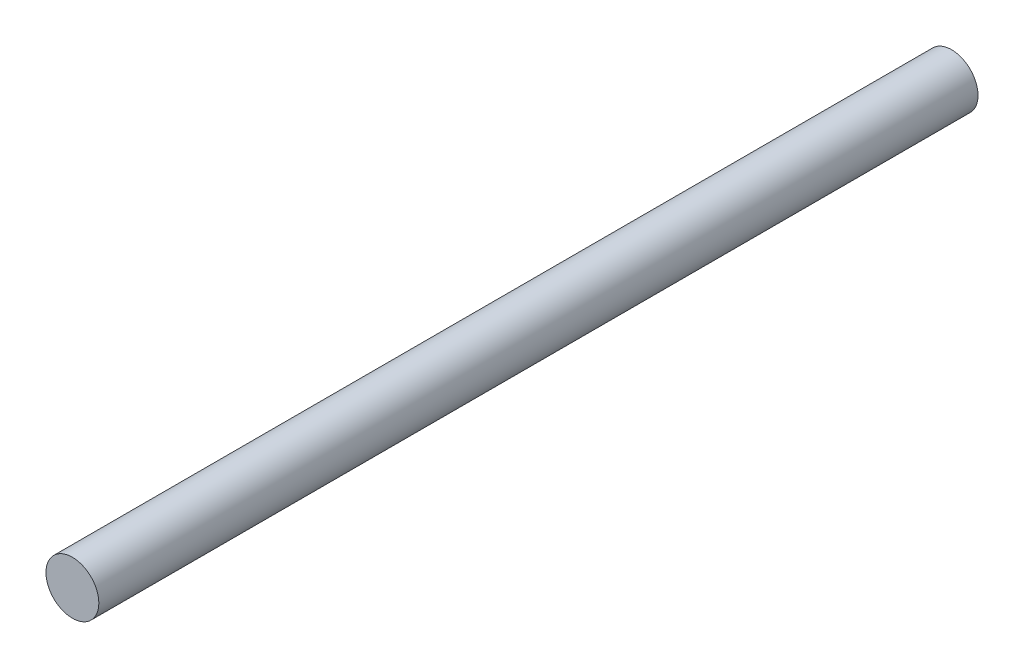
ISO-10303-21;
HEADER;
FILE_DESCRIPTION(('STEP AP214'),'2;1');
FILE_NAME('part.step','',(''),(''),'','','');
FILE_SCHEMA(('AUTOMOTIVE_DESIGN { 1 0 10303 214 1 1 1 1 }'));
ENDSEC;
DATA;
#1=APPLICATION_CONTEXT('core data for automotive mechanical design processes');
#2=APPLICATION_PROTOCOL_DEFINITION('international standard','automotive_design',2000,#1);
#3=PRODUCT_CONTEXT('',#1,'mechanical');
#4=PRODUCT('Part','Part','',(#3));
#5=PRODUCT_RELATED_PRODUCT_CATEGORY('part','',(#4));
#6=PRODUCT_DEFINITION_FORMATION('','',#4);
#7=PRODUCT_DEFINITION_CONTEXT('part definition',#1,'design');
#8=PRODUCT_DEFINITION('design','',#6,#7);
#9=PRODUCT_DEFINITION_SHAPE('','',#8);
#10=(LENGTH_UNIT() NAMED_UNIT(*) SI_UNIT(.MILLI.,.METRE.));
#11=(NAMED_UNIT(*) PLANE_ANGLE_UNIT() SI_UNIT($,.RADIAN.));
#12=(NAMED_UNIT(*) SI_UNIT($,.STERADIAN.) SOLID_ANGLE_UNIT());
#13=UNCERTAINTY_MEASURE_WITH_UNIT(LENGTH_MEASURE(1.E-05),#10,'distance_accuracy_value','');
#14=(GEOMETRIC_REPRESENTATION_CONTEXT(3) GLOBAL_UNCERTAINTY_ASSIGNED_CONTEXT((#13)) GLOBAL_UNIT_ASSIGNED_CONTEXT((#10,
#11,#12)) REPRESENTATION_CONTEXT('',''));
#15=CARTESIAN_POINT('',(0.,0.,0.));
#16=DIRECTION('',(0.,0.,1.));
#17=DIRECTION('',(1.,0.,0.));
#18=AXIS2_PLACEMENT_3D('',#15,#16,#17);
#19=CARTESIAN_POINT('',(0.,0.,99.765000114));
#20=DIRECTION('',(0.,0.,-1.));
#21=DIRECTION('',(-1.,0.,0.));
#22=AXIS2_PLACEMENT_3D('',#19,#20,#21);
#23=CYLINDRICAL_SURFACE('',#22,3.);
#24=CARTESIAN_POINT('',(0.,0.,99.765000114));
#25=DIRECTION('',(0.,0.,1.));
#26=DIRECTION('',(1.,0.,0.));
#27=AXIS2_PLACEMENT_3D('',#24,#25,#26);
#28=CIRCLE('',#27,3.);
#29=CARTESIAN_POINT('',(3.,0.,99.765000114));
#30=VERTEX_POINT('',#29);
#31=EDGE_CURVE('E10',#30,#30,#28,.T.);
#32=ORIENTED_EDGE('',*,*,#31,.F.);
#33=EDGE_LOOP('',(#32));
#34=FACE_BOUND('',#33,.T.);
#35=CARTESIAN_POINT('',(0.,0.,0.));
#36=DIRECTION('',(0.,0.,1.));
#37=DIRECTION('',(1.,0.,0.));
#38=AXIS2_PLACEMENT_3D('',#35,#36,#37);
#39=CIRCLE('',#38,3.);
#40=CARTESIAN_POINT('',(3.,0.,0.));
#41=VERTEX_POINT('',#40);
#42=EDGE_CURVE('E46',#41,#41,#39,.T.);
#43=ORIENTED_EDGE('',*,*,#42,.T.);
#44=EDGE_LOOP('',(#43));
#45=FACE_BOUND('',#44,.T.);
#46=ADVANCED_FACE('F43',(#34,#45),#23,.T.);
#47=CARTESIAN_POINT('',(0.,0.,99.765000114));
#48=DIRECTION('',(0.,0.,1.));
#49=DIRECTION('',(1.,0.,0.));
#50=AXIS2_PLACEMENT_3D('',#47,#48,#49);
#51=PLANE('',#50);
#52=ORIENTED_EDGE('',*,*,#31,.T.);
#53=EDGE_LOOP('',(#52));
#54=FACE_BOUND('',#53,.T.);
#55=ADVANCED_FACE('F58',(#54),#51,.T.);
#56=CARTESIAN_POINT('',(0.,0.,0.));
#57=DIRECTION('',(0.,0.,1.));
#58=DIRECTION('',(1.,0.,0.));
#59=AXIS2_PLACEMENT_3D('',#56,#57,#58);
#60=PLANE('',#59);
#61=ORIENTED_EDGE('',*,*,#42,.F.);
#62=EDGE_LOOP('',(#61));
#63=FACE_BOUND('',#62,.T.);
#64=ADVANCED_FACE('F59',(#63),#60,.F.);
#65=CLOSED_SHELL('',(#46,#55,#64));
#66=MANIFOLD_SOLID_BREP('B2',#65);
#67=ADVANCED_BREP_SHAPE_REPRESENTATION('',(#18,#66),#14);
#68=SHAPE_DEFINITION_REPRESENTATION(#9,#67);
ENDSEC;
END-ISO-10303-21;
